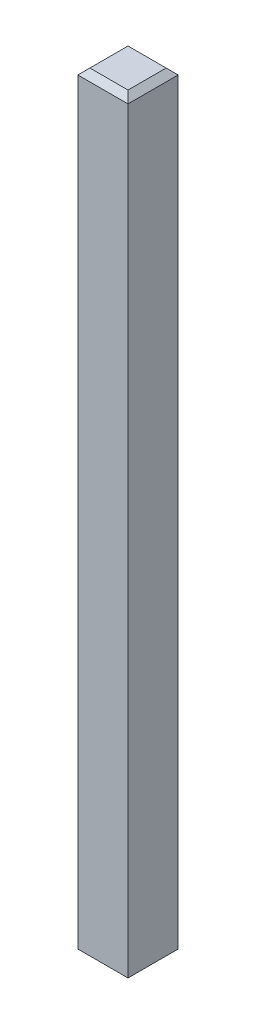
ISO-10303-21;
HEADER;
FILE_DESCRIPTION(('STEP AP214'),'2;1');
FILE_NAME('part.step','',(''),(''),'','','');
FILE_SCHEMA(('AUTOMOTIVE_DESIGN { 1 0 10303 214 1 1 1 1 }'));
ENDSEC;
DATA;
#1=APPLICATION_CONTEXT('core data for automotive mechanical design processes');
#2=APPLICATION_PROTOCOL_DEFINITION('international standard','automotive_design',2000,#1);
#3=PRODUCT_CONTEXT('',#1,'mechanical');
#4=PRODUCT('Part','Part','',(#3));
#5=PRODUCT_RELATED_PRODUCT_CATEGORY('part','',(#4));
#6=PRODUCT_DEFINITION_FORMATION('','',#4);
#7=PRODUCT_DEFINITION_CONTEXT('part definition',#1,'design');
#8=PRODUCT_DEFINITION('design','',#6,#7);
#9=PRODUCT_DEFINITION_SHAPE('','',#8);
#10=(LENGTH_UNIT() NAMED_UNIT(*) SI_UNIT(.MILLI.,.METRE.));
#11=(NAMED_UNIT(*) PLANE_ANGLE_UNIT() SI_UNIT($,.RADIAN.));
#12=(NAMED_UNIT(*) SI_UNIT($,.STERADIAN.) SOLID_ANGLE_UNIT());
#13=UNCERTAINTY_MEASURE_WITH_UNIT(LENGTH_MEASURE(1.E-05),#10,'distance_accuracy_value','');
#14=(GEOMETRIC_REPRESENTATION_CONTEXT(3) GLOBAL_UNCERTAINTY_ASSIGNED_CONTEXT((#13)) GLOBAL_UNIT_ASSIGNED_CONTEXT((#10,
#11,#12)) REPRESENTATION_CONTEXT('',''));
#15=CARTESIAN_POINT('',(0.,0.,0.));
#16=DIRECTION('',(0.,0.,1.));
#17=DIRECTION('',(1.,0.,0.));
#18=AXIS2_PLACEMENT_3D('',#15,#16,#17);
#19=CARTESIAN_POINT('',(0.375000000000002,11.5,-0.374999999999999));
#20=DIRECTION('',(-1.,0.,0.));
#21=DIRECTION('',(0.,0.,1.));
#22=AXIS2_PLACEMENT_3D('',#19,#20,#21);
#23=PLANE('',#22);
#24=DIRECTION('',(0.,-1.,0.));
#25=VECTOR('',#24,1.);
#26=CARTESIAN_POINT('',(0.375000000000002,11.5,0.375000000000001));
#27=LINE('',#26,#25);
#28=CARTESIAN_POINT('',(0.375000000000002,11.41,0.375000000000001));
#29=VERTEX_POINT('',#28);
#30=CARTESIAN_POINT('',(0.375000000000002,0.0899999999999998,0.375000000000001));
#31=VERTEX_POINT('',#30);
#32=EDGE_CURVE('E161',#29,#31,#27,.T.);
#33=ORIENTED_EDGE('',*,*,#32,.T.);
#34=DIRECTION('',(0.,0.,-1.));
#35=VECTOR('',#34,1.);
#36=CARTESIAN_POINT('',(0.375000000000002,0.0899999999999998,-0.374999999999999));
#37=LINE('',#36,#35);
#38=CARTESIAN_POINT('',(0.375000000000002,0.0899999999999998,-0.374999999999999));
#39=VERTEX_POINT('',#38);
#40=EDGE_CURVE('E175',#31,#39,#37,.T.);
#41=ORIENTED_EDGE('',*,*,#40,.T.);
#42=DIRECTION('',(0.,-1.,0.));
#43=VECTOR('',#42,1.);
#44=CARTESIAN_POINT('',(0.375000000000002,11.5,-0.374999999999999));
#45=LINE('',#44,#43);
#46=CARTESIAN_POINT('',(0.375000000000002,11.41,-0.374999999999999));
#47=VERTEX_POINT('',#46);
#48=EDGE_CURVE('E132',#47,#39,#45,.T.);
#49=ORIENTED_EDGE('',*,*,#48,.F.);
#50=DIRECTION('',(0.,0.,1.));
#51=VECTOR('',#50,1.);
#52=CARTESIAN_POINT('',(0.375000000000002,11.41,0.375000000000001));
#53=LINE('',#52,#51);
#54=EDGE_CURVE('E178',#47,#29,#53,.T.);
#55=ORIENTED_EDGE('',*,*,#54,.T.);
#56=EDGE_LOOP('',(#33,#41,#49,#55));
#57=FACE_BOUND('',#56,.T.);
#58=ADVANCED_FACE('F41',(#57),#23,.F.);
#59=CARTESIAN_POINT('',(-0.374999999999998,11.5,-0.374999999999999));
#60=DIRECTION('',(0.,0.,1.));
#61=DIRECTION('',(1.,0.,0.));
#62=AXIS2_PLACEMENT_3D('',#59,#60,#61);
#63=PLANE('',#62);
#64=ORIENTED_EDGE('',*,*,#48,.T.);
#65=DIRECTION('',(-1.,0.,0.));
#66=VECTOR('',#65,1.);
#67=CARTESIAN_POINT('',(-0.374999999999998,0.0899999999999998,-0.374999999999999));
#68=LINE('',#67,#66);
#69=CARTESIAN_POINT('',(-0.374999999999998,0.0899999999999998,-0.374999999999999));
#70=VERTEX_POINT('',#69);
#71=EDGE_CURVE('E130',#39,#70,#68,.T.);
#72=ORIENTED_EDGE('',*,*,#71,.T.);
#73=DIRECTION('',(0.,-1.,0.));
#74=VECTOR('',#73,1.);
#75=CARTESIAN_POINT('',(-0.374999999999998,11.5,-0.374999999999999));
#76=LINE('',#75,#74);
#77=CARTESIAN_POINT('',(-0.374999999999998,11.41,-0.374999999999999));
#78=VERTEX_POINT('',#77);
#79=EDGE_CURVE('E112',#78,#70,#76,.T.);
#80=ORIENTED_EDGE('',*,*,#79,.F.);
#81=DIRECTION('',(1.,0.,0.));
#82=VECTOR('',#81,1.);
#83=CARTESIAN_POINT('',(0.375000000000002,11.41,-0.374999999999999));
#84=LINE('',#83,#82);
#85=EDGE_CURVE('E127',#78,#47,#84,.T.);
#86=ORIENTED_EDGE('',*,*,#85,.T.);
#87=EDGE_LOOP('',(#64,#72,#80,#86));
#88=FACE_BOUND('',#87,.T.);
#89=ADVANCED_FACE('F126',(#88),#63,.F.);
#90=CARTESIAN_POINT('',(-0.374999999999998,11.5,-0.374999999999999));
#91=DIRECTION('',(1.,0.,0.));
#92=DIRECTION('',(0.,0.,-1.));
#93=AXIS2_PLACEMENT_3D('',#90,#91,#92);
#94=PLANE('',#93);
#95=ORIENTED_EDGE('',*,*,#79,.T.);
#96=DIRECTION('',(0.,0.,1.));
#97=VECTOR('',#96,1.);
#98=CARTESIAN_POINT('',(-0.374999999999998,0.0899999999999998,-0.374999999999999));
#99=LINE('',#98,#97);
#100=CARTESIAN_POINT('',(-0.374999999999998,0.0899999999999998,0.375000000000001));
#101=VERTEX_POINT('',#100);
#102=EDGE_CURVE('E119',#70,#101,#99,.T.);
#103=ORIENTED_EDGE('',*,*,#102,.T.);
#104=DIRECTION('',(0.,-1.,0.));
#105=VECTOR('',#104,1.);
#106=CARTESIAN_POINT('',(-0.374999999999998,11.5,0.375000000000001));
#107=LINE('',#106,#105);
#108=CARTESIAN_POINT('',(-0.374999999999998,11.41,0.375000000000001));
#109=VERTEX_POINT('',#108);
#110=EDGE_CURVE('E114',#109,#101,#107,.T.);
#111=ORIENTED_EDGE('',*,*,#110,.F.);
#112=DIRECTION('',(0.,0.,-1.));
#113=VECTOR('',#112,1.);
#114=CARTESIAN_POINT('',(-0.374999999999998,11.41,-0.374999999999999));
#115=LINE('',#114,#113);
#116=EDGE_CURVE('E109',#109,#78,#115,.T.);
#117=ORIENTED_EDGE('',*,*,#116,.T.);
#118=EDGE_LOOP('',(#95,#103,#111,#117));
#119=FACE_BOUND('',#118,.T.);
#120=ADVANCED_FACE('F111',(#119),#94,.F.);
#121=CARTESIAN_POINT('',(-0.374999999999998,11.5,0.375000000000001));
#122=DIRECTION('',(0.,0.,-1.));
#123=DIRECTION('',(-1.,0.,0.));
#124=AXIS2_PLACEMENT_3D('',#121,#122,#123);
#125=PLANE('',#124);
#126=ORIENTED_EDGE('',*,*,#110,.T.);
#127=DIRECTION('',(1.,0.,0.));
#128=VECTOR('',#127,1.);
#129=CARTESIAN_POINT('',(-0.374999999999998,0.0899999999999998,0.375000000000001));
#130=LINE('',#129,#128);
#131=EDGE_CURVE('E181',#101,#31,#130,.T.);
#132=ORIENTED_EDGE('',*,*,#131,.T.);
#133=ORIENTED_EDGE('',*,*,#32,.F.);
#134=DIRECTION('',(-1.,0.,0.));
#135=VECTOR('',#134,1.);
#136=CARTESIAN_POINT('',(-0.374999999999998,11.41,0.375000000000001));
#137=LINE('',#136,#135);
#138=EDGE_CURVE('E184',#29,#109,#137,.T.);
#139=ORIENTED_EDGE('',*,*,#138,.T.);
#140=EDGE_LOOP('',(#126,#132,#133,#139));
#141=FACE_BOUND('',#140,.T.);
#142=ADVANCED_FACE('F232',(#141),#125,.F.);
#143=CARTESIAN_POINT('',(0.,11.5,0.));
#144=DIRECTION('',(0.,1.,0.));
#145=DIRECTION('',(0.,0.,1.));
#146=AXIS2_PLACEMENT_3D('',#143,#144,#145);
#147=PLANE('',#146);
#148=DIRECTION('',(0.,0.,1.));
#149=VECTOR('',#148,1.);
#150=CARTESIAN_POINT('',(-0.284999999999998,11.5,0.375000000000001));
#151=LINE('',#150,#149);
#152=CARTESIAN_POINT('',(-0.284999999999998,11.5,-0.285));
#153=VERTEX_POINT('',#152);
#154=CARTESIAN_POINT('',(-0.284999999999998,11.5,0.285000000000001));
#155=VERTEX_POINT('',#154);
#156=EDGE_CURVE('E52',#153,#155,#151,.T.);
#157=ORIENTED_EDGE('',*,*,#156,.T.);
#158=DIRECTION('',(1.,0.,0.));
#159=VECTOR('',#158,1.);
#160=CARTESIAN_POINT('',(0.375000000000002,11.5,0.285000000000001));
#161=LINE('',#160,#159);
#162=CARTESIAN_POINT('',(0.285000000000002,11.5,0.285000000000001));
#163=VERTEX_POINT('',#162);
#164=EDGE_CURVE('E11',#155,#163,#161,.T.);
#165=ORIENTED_EDGE('',*,*,#164,.T.);
#166=DIRECTION('',(0.,0.,-1.));
#167=VECTOR('',#166,1.);
#168=CARTESIAN_POINT('',(0.285000000000002,11.5,-0.374999999999999));
#169=LINE('',#168,#167);
#170=CARTESIAN_POINT('',(0.285000000000002,11.5,-0.285));
#171=VERTEX_POINT('',#170);
#172=EDGE_CURVE('E172',#163,#171,#169,.T.);
#173=ORIENTED_EDGE('',*,*,#172,.T.);
#174=DIRECTION('',(-1.,0.,0.));
#175=VECTOR('',#174,1.);
#176=CARTESIAN_POINT('',(-0.374999999999998,11.5,-0.285));
#177=LINE('',#176,#175);
#178=EDGE_CURVE('E63',#171,#153,#177,.T.);
#179=ORIENTED_EDGE('',*,*,#178,.T.);
#180=EDGE_LOOP('',(#157,#165,#173,#179));
#181=FACE_BOUND('',#180,.T.);
#182=ADVANCED_FACE('F238',(#181),#147,.T.);
#183=CARTESIAN_POINT('',(0.,0.,0.));
#184=DIRECTION('',(0.,1.,0.));
#185=DIRECTION('',(0.,0.,1.));
#186=AXIS2_PLACEMENT_3D('',#183,#184,#185);
#187=PLANE('',#186);
#188=DIRECTION('',(0.,0.,-1.));
#189=VECTOR('',#188,1.);
#190=CARTESIAN_POINT('',(-0.284999999999998,0.,0.));
#191=LINE('',#190,#189);
#192=CARTESIAN_POINT('',(-0.284999999999998,0.,0.285000000000001));
#193=VERTEX_POINT('',#192);
#194=CARTESIAN_POINT('',(-0.284999999999998,0.,-0.285));
#195=VERTEX_POINT('',#194);
#196=EDGE_CURVE('E192',#193,#195,#191,.T.);
#197=ORIENTED_EDGE('',*,*,#196,.T.);
#198=DIRECTION('',(1.,0.,0.));
#199=VECTOR('',#198,1.);
#200=CARTESIAN_POINT('',(0.,0.,-0.285));
#201=LINE('',#200,#199);
#202=CARTESIAN_POINT('',(0.285000000000002,0.,-0.285));
#203=VERTEX_POINT('',#202);
#204=EDGE_CURVE('E120',#195,#203,#201,.T.);
#205=ORIENTED_EDGE('',*,*,#204,.T.);
#206=DIRECTION('',(0.,0.,1.));
#207=VECTOR('',#206,1.);
#208=CARTESIAN_POINT('',(0.285000000000002,0.,0.));
#209=LINE('',#208,#207);
#210=CARTESIAN_POINT('',(0.285000000000002,0.,0.285000000000001));
#211=VERTEX_POINT('',#210);
#212=EDGE_CURVE('E198',#203,#211,#209,.T.);
#213=ORIENTED_EDGE('',*,*,#212,.T.);
#214=DIRECTION('',(-1.,0.,0.));
#215=VECTOR('',#214,1.);
#216=CARTESIAN_POINT('',(0.,0.,0.285000000000001));
#217=LINE('',#216,#215);
#218=EDGE_CURVE('E195',#211,#193,#217,.T.);
#219=ORIENTED_EDGE('',*,*,#218,.T.);
#220=EDGE_LOOP('',(#197,#205,#213,#219));
#221=FACE_BOUND('',#220,.T.);
#222=ADVANCED_FACE('F240',(#221),#187,.F.);
#223=CARTESIAN_POINT('',(-0.374999999999998,0.0899999999999998,0.375000000000001));
#224=DIRECTION('',(0.,0.707106781186548,-0.707106781186548));
#225=DIRECTION('',(1.,0.,0.));
#226=AXIS2_PLACEMENT_3D('',#223,#224,#225);
#227=PLANE('',#226);
#228=DIRECTION('',(0.577350269189626,-0.577350269189626,-0.577350269189626));
#229=VECTOR('',#228,1.);
#230=CARTESIAN_POINT('',(-0.374999999999998,0.0899999999999998,0.375000000000001));
#231=LINE('',#230,#229);
#232=EDGE_CURVE('E162',#193,#101,#231,.F.);
#233=ORIENTED_EDGE('',*,*,#232,.F.);
#234=ORIENTED_EDGE('',*,*,#218,.F.);
#235=DIRECTION('',(-0.577350269189626,-0.577350269189626,-0.577350269189626));
#236=VECTOR('',#235,1.);
#237=CARTESIAN_POINT('',(0.125000000000002,-0.16,0.125));
#238=LINE('',#237,#236);
#239=EDGE_CURVE('E157',#31,#211,#238,.T.);
#240=ORIENTED_EDGE('',*,*,#239,.F.);
#241=ORIENTED_EDGE('',*,*,#131,.F.);
#242=EDGE_LOOP('',(#233,#234,#240,#241));
#243=FACE_BOUND('',#242,.T.);
#244=ADVANCED_FACE('F219',(#243),#227,.F.);
#245=CARTESIAN_POINT('',(0.375000000000002,0.0899999999999998,-0.374999999999999));
#246=DIRECTION('',(-0.707106781186548,0.707106781186548,0.));
#247=DIRECTION('',(0.,0.,-1.));
#248=AXIS2_PLACEMENT_3D('',#245,#246,#247);
#249=PLANE('',#248);
#250=ORIENTED_EDGE('',*,*,#239,.T.);
#251=ORIENTED_EDGE('',*,*,#212,.F.);
#252=DIRECTION('',(0.577350269189626,0.577350269189626,-0.577350269189626));
#253=VECTOR('',#252,1.);
#254=CARTESIAN_POINT('',(0.375000000000002,0.0899999999999998,-0.374999999999999));
#255=LINE('',#254,#253);
#256=EDGE_CURVE('E146',#39,#203,#255,.F.);
#257=ORIENTED_EDGE('',*,*,#256,.F.);
#258=ORIENTED_EDGE('',*,*,#40,.F.);
#259=EDGE_LOOP('',(#250,#251,#257,#258));
#260=FACE_BOUND('',#259,.T.);
#261=ADVANCED_FACE('F223',(#260),#249,.F.);
#262=CARTESIAN_POINT('',(-0.374999999999998,0.0899999999999998,-0.374999999999999));
#263=DIRECTION('',(0.707106781186548,0.707106781186548,0.));
#264=DIRECTION('',(0.,0.,1.));
#265=AXIS2_PLACEMENT_3D('',#262,#263,#264);
#266=PLANE('',#265);
#267=ORIENTED_EDGE('',*,*,#232,.T.);
#268=ORIENTED_EDGE('',*,*,#102,.F.);
#269=DIRECTION('',(0.577350269189626,-0.577350269189626,0.577350269189626));
#270=VECTOR('',#269,1.);
#271=CARTESIAN_POINT('',(-0.374999999999998,0.0899999999999998,-0.374999999999999));
#272=LINE('',#271,#270);
#273=EDGE_CURVE('E143',#195,#70,#272,.F.);
#274=ORIENTED_EDGE('',*,*,#273,.F.);
#275=ORIENTED_EDGE('',*,*,#196,.F.);
#276=EDGE_LOOP('',(#267,#268,#274,#275));
#277=FACE_BOUND('',#276,.T.);
#278=ADVANCED_FACE('F231',(#277),#266,.F.);
#279=CARTESIAN_POINT('',(-0.374999999999998,0.0899999999999998,-0.374999999999999));
#280=DIRECTION('',(0.,0.707106781186548,0.707106781186548));
#281=DIRECTION('',(-1.,0.,0.));
#282=AXIS2_PLACEMENT_3D('',#279,#280,#281);
#283=PLANE('',#282);
#284=ORIENTED_EDGE('',*,*,#256,.T.);
#285=ORIENTED_EDGE('',*,*,#204,.F.);
#286=ORIENTED_EDGE('',*,*,#273,.T.);
#287=ORIENTED_EDGE('',*,*,#71,.F.);
#288=EDGE_LOOP('',(#284,#285,#286,#287));
#289=FACE_BOUND('',#288,.T.);
#290=ADVANCED_FACE('F226',(#289),#283,.F.);
#291=CARTESIAN_POINT('',(0.,11.5,-0.285));
#292=DIRECTION('',(0.,0.707106781186548,-0.707106781186548));
#293=DIRECTION('',(1.,0.,0.));
#294=AXIS2_PLACEMENT_3D('',#291,#292,#293);
#295=PLANE('',#294);
#296=DIRECTION('',(-0.577350269189626,0.577350269189626,0.577350269189626));
#297=VECTOR('',#296,1.);
#298=CARTESIAN_POINT('',(0.190000000000002,11.595,-0.19));
#299=LINE('',#298,#297);
#300=EDGE_CURVE('E137',#47,#171,#299,.T.);
#301=ORIENTED_EDGE('',*,*,#300,.F.);
#302=ORIENTED_EDGE('',*,*,#85,.F.);
#303=DIRECTION('',(0.577350269189626,0.577350269189626,0.577350269189626));
#304=VECTOR('',#303,1.);
#305=CARTESIAN_POINT('',(-0.189999999999999,11.595,-0.19));
#306=LINE('',#305,#304);
#307=EDGE_CURVE('E46',#153,#78,#306,.F.);
#308=ORIENTED_EDGE('',*,*,#307,.F.);
#309=ORIENTED_EDGE('',*,*,#178,.F.);
#310=EDGE_LOOP('',(#301,#302,#308,#309));
#311=FACE_BOUND('',#310,.T.);
#312=ADVANCED_FACE('F44',(#311),#295,.T.);
#313=CARTESIAN_POINT('',(-0.284999999999998,11.5,0.));
#314=DIRECTION('',(-0.707106781186548,0.707106781186548,0.));
#315=DIRECTION('',(0.,0.,-1.));
#316=AXIS2_PLACEMENT_3D('',#313,#314,#315);
#317=PLANE('',#316);
#318=ORIENTED_EDGE('',*,*,#307,.T.);
#319=ORIENTED_EDGE('',*,*,#116,.F.);
#320=DIRECTION('',(0.577350269189626,0.577350269189626,-0.577350269189626));
#321=VECTOR('',#320,1.);
#322=CARTESIAN_POINT('',(-0.189999999999998,11.595,0.19));
#323=LINE('',#322,#321);
#324=EDGE_CURVE('E148',#155,#109,#323,.F.);
#325=ORIENTED_EDGE('',*,*,#324,.F.);
#326=ORIENTED_EDGE('',*,*,#156,.F.);
#327=EDGE_LOOP('',(#318,#319,#325,#326));
#328=FACE_BOUND('',#327,.T.);
#329=ADVANCED_FACE('F141',(#328),#317,.T.);
#330=CARTESIAN_POINT('',(0.285000000000002,11.5,0.));
#331=DIRECTION('',(0.707106781186548,0.707106781186548,0.));
#332=DIRECTION('',(0.,0.,1.));
#333=AXIS2_PLACEMENT_3D('',#330,#331,#332);
#334=PLANE('',#333);
#335=ORIENTED_EDGE('',*,*,#300,.T.);
#336=ORIENTED_EDGE('',*,*,#172,.F.);
#337=DIRECTION('',(0.577350269189626,-0.577350269189626,0.577350269189626));
#338=VECTOR('',#337,1.);
#339=CARTESIAN_POINT('',(0.190000000000002,11.595,0.19));
#340=LINE('',#339,#338);
#341=EDGE_CURVE('E152',#29,#163,#340,.F.);
#342=ORIENTED_EDGE('',*,*,#341,.F.);
#343=ORIENTED_EDGE('',*,*,#54,.F.);
#344=EDGE_LOOP('',(#335,#336,#342,#343));
#345=FACE_BOUND('',#344,.T.);
#346=ADVANCED_FACE('F237',(#345),#334,.T.);
#347=CARTESIAN_POINT('',(0.,11.5,0.285000000000001));
#348=DIRECTION('',(0.,0.707106781186548,0.707106781186548));
#349=DIRECTION('',(-1.,0.,0.));
#350=AXIS2_PLACEMENT_3D('',#347,#348,#349);
#351=PLANE('',#350);
#352=ORIENTED_EDGE('',*,*,#324,.T.);
#353=ORIENTED_EDGE('',*,*,#138,.F.);
#354=ORIENTED_EDGE('',*,*,#341,.T.);
#355=ORIENTED_EDGE('',*,*,#164,.F.);
#356=EDGE_LOOP('',(#352,#353,#354,#355));
#357=FACE_BOUND('',#356,.T.);
#358=ADVANCED_FACE('F235',(#357),#351,.T.);
#359=CLOSED_SHELL('',(#58,#89,#120,#142,#182,#222,#244,#261,#278,#290,#312,#329,#346,#358));
#360=MANIFOLD_SOLID_BREP('B2',#359);
#361=ADVANCED_BREP_SHAPE_REPRESENTATION('',(#18,#360),#14);
#362=SHAPE_DEFINITION_REPRESENTATION(#9,#361);
ENDSEC;
END-ISO-10303-21;
